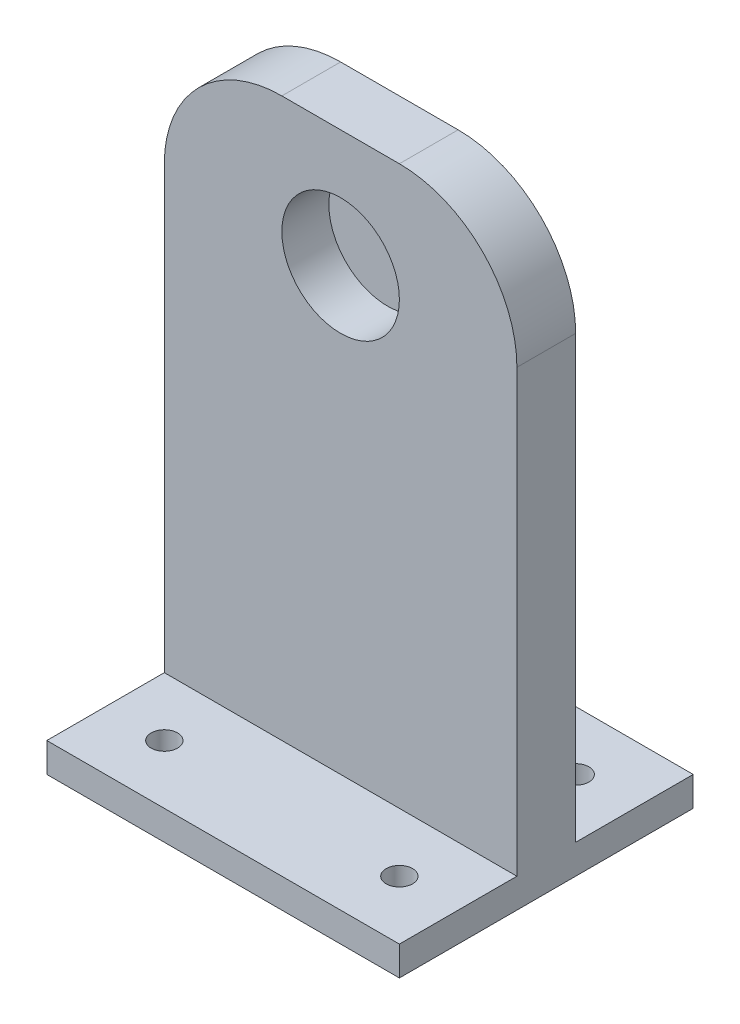
ISO-10303-21;
HEADER;
FILE_DESCRIPTION(('STEP AP214'),'2;1');
FILE_NAME('part.step','',(''),(''),'','','');
FILE_SCHEMA(('AUTOMOTIVE_DESIGN { 1 0 10303 214 1 1 1 1 }'));
ENDSEC;
DATA;
#1=APPLICATION_CONTEXT('core data for automotive mechanical design processes');
#2=APPLICATION_PROTOCOL_DEFINITION('international standard','automotive_design',2000,#1);
#3=PRODUCT_CONTEXT('',#1,'mechanical');
#4=PRODUCT('Part','Part','',(#3));
#5=PRODUCT_RELATED_PRODUCT_CATEGORY('part','',(#4));
#6=PRODUCT_DEFINITION_FORMATION('','',#4);
#7=PRODUCT_DEFINITION_CONTEXT('part definition',#1,'design');
#8=PRODUCT_DEFINITION('design','',#6,#7);
#9=PRODUCT_DEFINITION_SHAPE('','',#8);
#10=(LENGTH_UNIT() NAMED_UNIT(*) SI_UNIT(.MILLI.,.METRE.));
#11=(NAMED_UNIT(*) PLANE_ANGLE_UNIT() SI_UNIT($,.RADIAN.));
#12=(NAMED_UNIT(*) SI_UNIT($,.STERADIAN.) SOLID_ANGLE_UNIT());
#13=UNCERTAINTY_MEASURE_WITH_UNIT(LENGTH_MEASURE(1.E-05),#10,'distance_accuracy_value','');
#14=(GEOMETRIC_REPRESENTATION_CONTEXT(3) GLOBAL_UNCERTAINTY_ASSIGNED_CONTEXT((#13)) GLOBAL_UNIT_ASSIGNED_CONTEXT((#10,
#11,#12)) REPRESENTATION_CONTEXT('',''));
#15=CARTESIAN_POINT('',(0.,0.,0.));
#16=DIRECTION('',(0.,0.,1.));
#17=DIRECTION('',(1.,0.,0.));
#18=AXIS2_PLACEMENT_3D('',#15,#16,#17);
#19=CARTESIAN_POINT('',(0.,0.,10.));
#20=DIRECTION('',(0.,0.,1.));
#21=DIRECTION('',(1.,0.,0.));
#22=AXIS2_PLACEMENT_3D('',#19,#20,#21);
#23=PLANE('',#22);
#24=CARTESIAN_POINT('',(0.,80.,10.));
#25=DIRECTION('',(0.,0.,1.));
#26=DIRECTION('',(1.,0.,0.));
#27=AXIS2_PLACEMENT_3D('',#24,#25,#26);
#28=CIRCLE('',#27,10.);
#29=CARTESIAN_POINT('',(10.,80.,10.));
#30=VERTEX_POINT('',#29);
#31=EDGE_CURVE('E171',#30,#30,#28,.T.);
#32=ORIENTED_EDGE('',*,*,#31,.F.);
#33=EDGE_LOOP('',(#32));
#34=FACE_BOUND('',#33,.T.);
#35=DIRECTION('',(0.,-1.,0.));
#36=VECTOR('',#35,1.);
#37=CARTESIAN_POINT('',(-30.,100.,10.));
#38=LINE('',#37,#36);
#39=CARTESIAN_POINT('',(-30.,80.,10.));
#40=VERTEX_POINT('',#39);
#41=CARTESIAN_POINT('',(-30.,5.,10.));
#42=VERTEX_POINT('',#41);
#43=EDGE_CURVE('E59',#40,#42,#38,.T.);
#44=ORIENTED_EDGE('',*,*,#43,.T.);
#45=DIRECTION('',(1.,0.,0.));
#46=VECTOR('',#45,1.);
#47=CARTESIAN_POINT('',(0.,5.,10.));
#48=LINE('',#47,#46);
#49=CARTESIAN_POINT('',(30.,5.,10.));
#50=VERTEX_POINT('',#49);
#51=EDGE_CURVE('E63',#42,#50,#48,.T.);
#52=ORIENTED_EDGE('',*,*,#51,.T.);
#53=DIRECTION('',(0.,1.,0.));
#54=VECTOR('',#53,1.);
#55=CARTESIAN_POINT('',(30.,100.,10.));
#56=LINE('',#55,#54);
#57=CARTESIAN_POINT('',(30.,80.,10.));
#58=VERTEX_POINT('',#57);
#59=EDGE_CURVE('E175',#50,#58,#56,.T.);
#60=ORIENTED_EDGE('',*,*,#59,.T.);
#61=CARTESIAN_POINT('',(10.,80.,10.));
#62=DIRECTION('',(0.,0.,1.));
#63=DIRECTION('',(1.,0.,0.));
#64=AXIS2_PLACEMENT_3D('',#61,#62,#63);
#65=CIRCLE('',#64,20.);
#66=CARTESIAN_POINT('',(10.,100.,10.));
#67=VERTEX_POINT('',#66);
#68=EDGE_CURVE('E52',#58,#67,#65,.T.);
#69=ORIENTED_EDGE('',*,*,#68,.T.);
#70=DIRECTION('',(-1.,0.,0.));
#71=VECTOR('',#70,1.);
#72=CARTESIAN_POINT('',(-30.,100.,10.));
#73=LINE('',#72,#71);
#74=CARTESIAN_POINT('',(-9.99999999999999,100.,10.));
#75=VERTEX_POINT('',#74);
#76=EDGE_CURVE('E178',#67,#75,#73,.T.);
#77=ORIENTED_EDGE('',*,*,#76,.T.);
#78=CARTESIAN_POINT('',(-9.99999999999999,80.,10.));
#79=DIRECTION('',(0.,0.,1.));
#80=DIRECTION('',(1.,0.,0.));
#81=AXIS2_PLACEMENT_3D('',#78,#79,#80);
#82=CIRCLE('',#81,20.);
#83=EDGE_CURVE('E203',#75,#40,#82,.T.);
#84=ORIENTED_EDGE('',*,*,#83,.T.);
#85=EDGE_LOOP('',(#44,#52,#60,#69,#77,#84));
#86=FACE_BOUND('',#85,.T.);
#87=ADVANCED_FACE('F44',(#34,#86),#23,.T.);
#88=CARTESIAN_POINT('',(0.,0.,0.));
#89=DIRECTION('',(0.,0.,1.));
#90=DIRECTION('',(1.,0.,0.));
#91=AXIS2_PLACEMENT_3D('',#88,#89,#90);
#92=PLANE('',#91);
#93=DIRECTION('',(1.,0.,0.));
#94=VECTOR('',#93,1.);
#95=CARTESIAN_POINT('',(0.,5.,0.));
#96=LINE('',#95,#94);
#97=CARTESIAN_POINT('',(-30.,5.,0.));
#98=VERTEX_POINT('',#97);
#99=CARTESIAN_POINT('',(30.,5.,0.));
#100=VERTEX_POINT('',#99);
#101=EDGE_CURVE('E161',#98,#100,#96,.T.);
#102=ORIENTED_EDGE('',*,*,#101,.F.);
#103=DIRECTION('',(0.,-1.,0.));
#104=VECTOR('',#103,1.);
#105=CARTESIAN_POINT('',(-30.,100.,0.));
#106=LINE('',#105,#104);
#107=CARTESIAN_POINT('',(-30.,80.,0.));
#108=VERTEX_POINT('',#107);
#109=EDGE_CURVE('E125',#108,#98,#106,.T.);
#110=ORIENTED_EDGE('',*,*,#109,.F.);
#111=CARTESIAN_POINT('',(-9.99999999999999,80.,0.));
#112=DIRECTION('',(0.,0.,1.));
#113=DIRECTION('',(1.,0.,0.));
#114=AXIS2_PLACEMENT_3D('',#111,#112,#113);
#115=CIRCLE('',#114,20.);
#116=CARTESIAN_POINT('',(-9.99999999999999,100.,0.));
#117=VERTEX_POINT('',#116);
#118=EDGE_CURVE('E195',#108,#117,#115,.F.);
#119=ORIENTED_EDGE('',*,*,#118,.T.);
#120=DIRECTION('',(-1.,0.,0.));
#121=VECTOR('',#120,1.);
#122=CARTESIAN_POINT('',(-30.,100.,0.));
#123=LINE('',#122,#121);
#124=CARTESIAN_POINT('',(10.,100.,0.));
#125=VERTEX_POINT('',#124);
#126=EDGE_CURVE('E176',#125,#117,#123,.T.);
#127=ORIENTED_EDGE('',*,*,#126,.F.);
#128=CARTESIAN_POINT('',(10.,80.,0.));
#129=DIRECTION('',(0.,0.,1.));
#130=DIRECTION('',(1.,0.,0.));
#131=AXIS2_PLACEMENT_3D('',#128,#129,#130);
#132=CIRCLE('',#131,20.);
#133=CARTESIAN_POINT('',(30.,80.,0.));
#134=VERTEX_POINT('',#133);
#135=EDGE_CURVE('E197',#125,#134,#132,.F.);
#136=ORIENTED_EDGE('',*,*,#135,.T.);
#137=DIRECTION('',(0.,1.,0.));
#138=VECTOR('',#137,1.);
#139=CARTESIAN_POINT('',(30.,100.,0.));
#140=LINE('',#139,#138);
#141=EDGE_CURVE('E183',#100,#134,#140,.T.);
#142=ORIENTED_EDGE('',*,*,#141,.F.);
#143=EDGE_LOOP('',(#102,#110,#119,#127,#136,#142));
#144=FACE_BOUND('',#143,.T.);
#145=ADVANCED_FACE('F217',(#144),#92,.F.);
#146=CARTESIAN_POINT('',(0.,80.,10.));
#147=DIRECTION('',(0.,0.,-1.));
#148=DIRECTION('',(-1.,0.,0.));
#149=AXIS2_PLACEMENT_3D('',#146,#147,#148);
#150=CYLINDRICAL_SURFACE('',#149,10.);
#151=ORIENTED_EDGE('',*,*,#31,.T.);
#152=EDGE_LOOP('',(#151));
#153=FACE_BOUND('',#152,.T.);
#154=CARTESIAN_POINT('',(0.,80.,2.));
#155=DIRECTION('',(0.,0.,-1.));
#156=DIRECTION('',(-1.,0.,0.));
#157=AXIS2_PLACEMENT_3D('',#154,#155,#156);
#158=CIRCLE('',#157,10.);
#159=CARTESIAN_POINT('',(-10.,80.,2.));
#160=VERTEX_POINT('',#159);
#161=EDGE_CURVE('E168',#160,#160,#158,.T.);
#162=ORIENTED_EDGE('',*,*,#161,.T.);
#163=EDGE_LOOP('',(#162));
#164=FACE_BOUND('',#163,.T.);
#165=ADVANCED_FACE('F241',(#153,#164),#150,.F.);
#166=CARTESIAN_POINT('',(-30.,100.,10.));
#167=DIRECTION('',(1.,0.,0.));
#168=DIRECTION('',(0.,1.,0.));
#169=AXIS2_PLACEMENT_3D('',#166,#167,#168);
#170=PLANE('',#169);
#171=DIRECTION('',(0.,0.,-1.));
#172=VECTOR('',#171,1.);
#173=CARTESIAN_POINT('',(-30.,0.,10.));
#174=LINE('',#173,#172);
#175=CARTESIAN_POINT('',(-30.,0.,30.));
#176=VERTEX_POINT('',#175);
#177=CARTESIAN_POINT('',(-30.,0.,-20.));
#178=VERTEX_POINT('',#177);
#179=EDGE_CURVE('E188',#176,#178,#174,.T.);
#180=ORIENTED_EDGE('',*,*,#179,.F.);
#181=DIRECTION('',(0.,-1.,0.));
#182=VECTOR('',#181,1.);
#183=CARTESIAN_POINT('',(-30.,5.,30.));
#184=LINE('',#183,#182);
#185=CARTESIAN_POINT('',(-30.,5.,30.));
#186=VERTEX_POINT('',#185);
#187=EDGE_CURVE('E158',#186,#176,#184,.T.);
#188=ORIENTED_EDGE('',*,*,#187,.F.);
#189=DIRECTION('',(0.,0.,-1.));
#190=VECTOR('',#189,1.);
#191=CARTESIAN_POINT('',(-30.,5.,30.));
#192=LINE('',#191,#190);
#193=EDGE_CURVE('E129',#186,#42,#192,.T.);
#194=ORIENTED_EDGE('',*,*,#193,.T.);
#195=ORIENTED_EDGE('',*,*,#43,.F.);
#196=DIRECTION('',(0.,0.,-1.));
#197=VECTOR('',#196,1.);
#198=CARTESIAN_POINT('',(-30.,80.,10.));
#199=LINE('',#198,#197);
#200=EDGE_CURVE('E13',#40,#108,#199,.T.);
#201=ORIENTED_EDGE('',*,*,#200,.T.);
#202=ORIENTED_EDGE('',*,*,#109,.T.);
#203=CARTESIAN_POINT('',(-30.,5.,-20.));
#204=VERTEX_POINT('',#203);
#205=EDGE_CURVE('E119',#98,#204,#192,.T.);
#206=ORIENTED_EDGE('',*,*,#205,.T.);
#207=DIRECTION('',(0.,-1.,0.));
#208=VECTOR('',#207,1.);
#209=CARTESIAN_POINT('',(-30.,5.,-20.));
#210=LINE('',#209,#208);
#211=EDGE_CURVE('E122',#204,#178,#210,.T.);
#212=ORIENTED_EDGE('',*,*,#211,.T.);
#213=EDGE_LOOP('',(#180,#188,#194,#195,#201,#202,#206,#212));
#214=FACE_BOUND('',#213,.T.);
#215=ADVANCED_FACE('F121',(#214),#170,.F.);
#216=CARTESIAN_POINT('',(-30.,0.,10.));
#217=DIRECTION('',(0.,1.,0.));
#218=DIRECTION('',(0.,0.,1.));
#219=AXIS2_PLACEMENT_3D('',#216,#217,#218);
#220=PLANE('',#219);
#221=CARTESIAN_POINT('',(20.,0.,-10.));
#222=DIRECTION('',(0.,1.,0.));
#223=DIRECTION('',(0.,0.,1.));
#224=AXIS2_PLACEMENT_3D('',#221,#222,#223);
#225=CIRCLE('',#224,2.25);
#226=CARTESIAN_POINT('',(20.,0.,-7.75));
#227=VERTEX_POINT('',#226);
#228=EDGE_CURVE('E303',#227,#227,#225,.T.);
#229=ORIENTED_EDGE('',*,*,#228,.T.);
#230=EDGE_LOOP('',(#229));
#231=FACE_BOUND('',#230,.T.);
#232=CARTESIAN_POINT('',(-20.,0.,20.));
#233=DIRECTION('',(0.,1.,0.));
#234=DIRECTION('',(0.,0.,1.));
#235=AXIS2_PLACEMENT_3D('',#232,#233,#234);
#236=CIRCLE('',#235,2.25);
#237=CARTESIAN_POINT('',(-20.,0.,22.25));
#238=VERTEX_POINT('',#237);
#239=EDGE_CURVE('E309',#238,#238,#236,.T.);
#240=ORIENTED_EDGE('',*,*,#239,.T.);
#241=EDGE_LOOP('',(#240));
#242=FACE_BOUND('',#241,.T.);
#243=CARTESIAN_POINT('',(20.,0.,20.));
#244=DIRECTION('',(0.,1.,0.));
#245=DIRECTION('',(0.,0.,1.));
#246=AXIS2_PLACEMENT_3D('',#243,#244,#245);
#247=CIRCLE('',#246,2.25);
#248=CARTESIAN_POINT('',(20.,0.,22.25));
#249=VERTEX_POINT('',#248);
#250=EDGE_CURVE('E294',#249,#249,#247,.T.);
#251=ORIENTED_EDGE('',*,*,#250,.T.);
#252=EDGE_LOOP('',(#251));
#253=FACE_BOUND('',#252,.T.);
#254=CARTESIAN_POINT('',(-20.,0.,-10.));
#255=DIRECTION('',(0.,1.,0.));
#256=DIRECTION('',(0.,0.,1.));
#257=AXIS2_PLACEMENT_3D('',#254,#255,#256);
#258=CIRCLE('',#257,2.25);
#259=CARTESIAN_POINT('',(-20.,0.,-7.75));
#260=VERTEX_POINT('',#259);
#261=EDGE_CURVE('E155',#260,#260,#258,.T.);
#262=ORIENTED_EDGE('',*,*,#261,.T.);
#263=EDGE_LOOP('',(#262));
#264=FACE_BOUND('',#263,.T.);
#265=ORIENTED_EDGE('',*,*,#179,.T.);
#266=DIRECTION('',(1.,0.,0.));
#267=VECTOR('',#266,1.);
#268=CARTESIAN_POINT('',(-30.,0.,-20.));
#269=LINE('',#268,#267);
#270=CARTESIAN_POINT('',(30.,0.,-20.));
#271=VERTEX_POINT('',#270);
#272=EDGE_CURVE('E138',#178,#271,#269,.T.);
#273=ORIENTED_EDGE('',*,*,#272,.T.);
#274=DIRECTION('',(0.,0.,-1.));
#275=VECTOR('',#274,1.);
#276=CARTESIAN_POINT('',(30.,0.,10.));
#277=LINE('',#276,#275);
#278=CARTESIAN_POINT('',(30.,0.,30.));
#279=VERTEX_POINT('',#278);
#280=EDGE_CURVE('E181',#279,#271,#277,.T.);
#281=ORIENTED_EDGE('',*,*,#280,.F.);
#282=DIRECTION('',(-1.,0.,0.));
#283=VECTOR('',#282,1.);
#284=CARTESIAN_POINT('',(-30.,0.,30.));
#285=LINE('',#284,#283);
#286=EDGE_CURVE('E130',#279,#176,#285,.T.);
#287=ORIENTED_EDGE('',*,*,#286,.T.);
#288=EDGE_LOOP('',(#265,#273,#281,#287));
#289=FACE_BOUND('',#288,.T.);
#290=ADVANCED_FACE('F232',(#231,#242,#253,#264,#289),#220,.F.);
#291=CARTESIAN_POINT('',(30.,100.,10.));
#292=DIRECTION('',(-1.,0.,0.));
#293=DIRECTION('',(0.,-1.,0.));
#294=AXIS2_PLACEMENT_3D('',#291,#292,#293);
#295=PLANE('',#294);
#296=ORIENTED_EDGE('',*,*,#280,.T.);
#297=DIRECTION('',(0.,-1.,0.));
#298=VECTOR('',#297,1.);
#299=CARTESIAN_POINT('',(30.,5.,-20.));
#300=LINE('',#299,#298);
#301=CARTESIAN_POINT('',(30.,5.,-20.));
#302=VERTEX_POINT('',#301);
#303=EDGE_CURVE('E139',#302,#271,#300,.T.);
#304=ORIENTED_EDGE('',*,*,#303,.F.);
#305=DIRECTION('',(0.,0.,1.));
#306=VECTOR('',#305,1.);
#307=CARTESIAN_POINT('',(30.,5.,30.));
#308=LINE('',#307,#306);
#309=EDGE_CURVE('E145',#302,#100,#308,.T.);
#310=ORIENTED_EDGE('',*,*,#309,.T.);
#311=ORIENTED_EDGE('',*,*,#141,.T.);
#312=DIRECTION('',(0.,0.,-1.));
#313=VECTOR('',#312,1.);
#314=CARTESIAN_POINT('',(30.,80.,10.));
#315=LINE('',#314,#313);
#316=EDGE_CURVE('E200',#134,#58,#315,.F.);
#317=ORIENTED_EDGE('',*,*,#316,.T.);
#318=ORIENTED_EDGE('',*,*,#59,.F.);
#319=CARTESIAN_POINT('',(30.,5.,30.));
#320=VERTEX_POINT('',#319);
#321=EDGE_CURVE('E146',#50,#320,#308,.T.);
#322=ORIENTED_EDGE('',*,*,#321,.T.);
#323=DIRECTION('',(0.,-1.,0.));
#324=VECTOR('',#323,1.);
#325=CARTESIAN_POINT('',(30.,5.,30.));
#326=LINE('',#325,#324);
#327=EDGE_CURVE('E162',#320,#279,#326,.T.);
#328=ORIENTED_EDGE('',*,*,#327,.T.);
#329=EDGE_LOOP('',(#296,#304,#310,#311,#317,#318,#322,#328));
#330=FACE_BOUND('',#329,.T.);
#331=ADVANCED_FACE('F230',(#330),#295,.F.);
#332=CARTESIAN_POINT('',(-30.,100.,10.));
#333=DIRECTION('',(0.,-1.,0.));
#334=DIRECTION('',(0.,0.,-1.));
#335=AXIS2_PLACEMENT_3D('',#332,#333,#334);
#336=PLANE('',#335);
#337=ORIENTED_EDGE('',*,*,#76,.F.);
#338=DIRECTION('',(0.,0.,-1.));
#339=VECTOR('',#338,1.);
#340=CARTESIAN_POINT('',(10.,100.,10.));
#341=LINE('',#340,#339);
#342=EDGE_CURVE('E192',#67,#125,#341,.T.);
#343=ORIENTED_EDGE('',*,*,#342,.T.);
#344=ORIENTED_EDGE('',*,*,#126,.T.);
#345=DIRECTION('',(0.,0.,-1.));
#346=VECTOR('',#345,1.);
#347=CARTESIAN_POINT('',(-9.99999999999999,100.,10.));
#348=LINE('',#347,#346);
#349=EDGE_CURVE('E190',#117,#75,#348,.F.);
#350=ORIENTED_EDGE('',*,*,#349,.T.);
#351=EDGE_LOOP('',(#337,#343,#344,#350));
#352=FACE_BOUND('',#351,.T.);
#353=ADVANCED_FACE('F211',(#352),#336,.F.);
#354=CARTESIAN_POINT('',(0.,80.,2.));
#355=DIRECTION('',(0.,0.,-1.));
#356=DIRECTION('',(-1.,0.,0.));
#357=AXIS2_PLACEMENT_3D('',#354,#355,#356);
#358=PLANE('',#357);
#359=ORIENTED_EDGE('',*,*,#161,.F.);
#360=EDGE_LOOP('',(#359));
#361=FACE_BOUND('',#360,.T.);
#362=ADVANCED_FACE('F257',(#361),#358,.F.);
#363=CARTESIAN_POINT('',(10.,80.,10.));
#364=DIRECTION('',(0.,0.,-1.));
#365=DIRECTION('',(-1.,0.,0.));
#366=AXIS2_PLACEMENT_3D('',#363,#364,#365);
#367=CYLINDRICAL_SURFACE('',#366,20.);
#368=ORIENTED_EDGE('',*,*,#68,.F.);
#369=ORIENTED_EDGE('',*,*,#316,.F.);
#370=ORIENTED_EDGE('',*,*,#135,.F.);
#371=ORIENTED_EDGE('',*,*,#342,.F.);
#372=EDGE_LOOP('',(#368,#369,#370,#371));
#373=FACE_BOUND('',#372,.T.);
#374=ADVANCED_FACE('F214',(#373),#367,.T.);
#375=CARTESIAN_POINT('',(-9.99999999999999,80.,10.));
#376=DIRECTION('',(0.,0.,-1.));
#377=DIRECTION('',(-1.,0.,0.));
#378=AXIS2_PLACEMENT_3D('',#375,#376,#377);
#379=CYLINDRICAL_SURFACE('',#378,20.);
#380=ORIENTED_EDGE('',*,*,#83,.F.);
#381=ORIENTED_EDGE('',*,*,#349,.F.);
#382=ORIENTED_EDGE('',*,*,#118,.F.);
#383=ORIENTED_EDGE('',*,*,#200,.F.);
#384=EDGE_LOOP('',(#380,#381,#382,#383));
#385=FACE_BOUND('',#384,.T.);
#386=ADVANCED_FACE('F46',(#385),#379,.T.);
#387=CARTESIAN_POINT('',(-30.,5.,-20.));
#388=DIRECTION('',(0.,0.,-1.));
#389=DIRECTION('',(-1.,0.,0.));
#390=AXIS2_PLACEMENT_3D('',#387,#388,#389);
#391=PLANE('',#390);
#392=ORIENTED_EDGE('',*,*,#272,.F.);
#393=ORIENTED_EDGE('',*,*,#211,.F.);
#394=DIRECTION('',(1.,0.,0.));
#395=VECTOR('',#394,1.);
#396=CARTESIAN_POINT('',(-30.,5.,-20.));
#397=LINE('',#396,#395);
#398=EDGE_CURVE('E136',#204,#302,#397,.T.);
#399=ORIENTED_EDGE('',*,*,#398,.T.);
#400=ORIENTED_EDGE('',*,*,#303,.T.);
#401=EDGE_LOOP('',(#392,#393,#399,#400));
#402=FACE_BOUND('',#401,.T.);
#403=ADVANCED_FACE('F134',(#402),#391,.T.);
#404=CARTESIAN_POINT('',(0.,5.,0.));
#405=DIRECTION('',(0.,-1.,0.));
#406=DIRECTION('',(0.,0.,-1.));
#407=AXIS2_PLACEMENT_3D('',#404,#405,#406);
#408=PLANE('',#407);
#409=CARTESIAN_POINT('',(20.,5.,-10.));
#410=DIRECTION('',(0.,1.,0.));
#411=DIRECTION('',(0.,0.,1.));
#412=AXIS2_PLACEMENT_3D('',#409,#410,#411);
#413=CIRCLE('',#412,2.25);
#414=CARTESIAN_POINT('',(20.,5.,-7.75));
#415=VERTEX_POINT('',#414);
#416=EDGE_CURVE('E306',#415,#415,#413,.T.);
#417=ORIENTED_EDGE('',*,*,#416,.F.);
#418=EDGE_LOOP('',(#417));
#419=FACE_BOUND('',#418,.T.);
#420=CARTESIAN_POINT('',(-20.,5.,-10.));
#421=DIRECTION('',(0.,1.,0.));
#422=DIRECTION('',(0.,0.,1.));
#423=AXIS2_PLACEMENT_3D('',#420,#421,#422);
#424=CIRCLE('',#423,2.25);
#425=CARTESIAN_POINT('',(-20.,5.,-7.75));
#426=VERTEX_POINT('',#425);
#427=EDGE_CURVE('E305',#426,#426,#424,.T.);
#428=ORIENTED_EDGE('',*,*,#427,.F.);
#429=EDGE_LOOP('',(#428));
#430=FACE_BOUND('',#429,.T.);
#431=ORIENTED_EDGE('',*,*,#205,.F.);
#432=ORIENTED_EDGE('',*,*,#101,.T.);
#433=ORIENTED_EDGE('',*,*,#309,.F.);
#434=ORIENTED_EDGE('',*,*,#398,.F.);
#435=EDGE_LOOP('',(#431,#432,#433,#434));
#436=FACE_BOUND('',#435,.T.);
#437=ADVANCED_FACE('F143',(#419,#430,#436),#408,.F.);
#438=CARTESIAN_POINT('',(-30.,5.,30.));
#439=DIRECTION('',(0.,0.,1.));
#440=DIRECTION('',(1.,0.,0.));
#441=AXIS2_PLACEMENT_3D('',#438,#439,#440);
#442=PLANE('',#441);
#443=ORIENTED_EDGE('',*,*,#286,.F.);
#444=ORIENTED_EDGE('',*,*,#327,.F.);
#445=DIRECTION('',(-1.,0.,0.));
#446=VECTOR('',#445,1.);
#447=CARTESIAN_POINT('',(-30.,5.,30.));
#448=LINE('',#447,#446);
#449=EDGE_CURVE('E140',#320,#186,#448,.T.);
#450=ORIENTED_EDGE('',*,*,#449,.T.);
#451=ORIENTED_EDGE('',*,*,#187,.T.);
#452=EDGE_LOOP('',(#443,#444,#450,#451));
#453=FACE_BOUND('',#452,.T.);
#454=ADVANCED_FACE('F228',(#453),#442,.T.);
#455=CARTESIAN_POINT('',(-20.,5.,20.));
#456=DIRECTION('',(0.,1.,0.));
#457=DIRECTION('',(0.,0.,1.));
#458=AXIS2_PLACEMENT_3D('',#455,#456,#457);
#459=CIRCLE('',#458,2.25);
#460=CARTESIAN_POINT('',(-20.,5.,22.25));
#461=VERTEX_POINT('',#460);
#462=EDGE_CURVE('E300',#461,#461,#459,.T.);
#463=ORIENTED_EDGE('',*,*,#462,.F.);
#464=EDGE_LOOP('',(#463));
#465=FACE_BOUND('',#464,.T.);
#466=CARTESIAN_POINT('',(20.,5.,20.));
#467=DIRECTION('',(0.,1.,0.));
#468=DIRECTION('',(0.,0.,1.));
#469=AXIS2_PLACEMENT_3D('',#466,#467,#468);
#470=CIRCLE('',#469,2.25);
#471=CARTESIAN_POINT('',(20.,5.,22.25));
#472=VERTEX_POINT('',#471);
#473=EDGE_CURVE('E297',#472,#472,#470,.T.);
#474=ORIENTED_EDGE('',*,*,#473,.F.);
#475=EDGE_LOOP('',(#474));
#476=FACE_BOUND('',#475,.T.);
#477=ORIENTED_EDGE('',*,*,#51,.F.);
#478=ORIENTED_EDGE('',*,*,#193,.F.);
#479=ORIENTED_EDGE('',*,*,#449,.F.);
#480=ORIENTED_EDGE('',*,*,#321,.F.);
#481=EDGE_LOOP('',(#477,#478,#479,#480));
#482=FACE_BOUND('',#481,.T.);
#483=ADVANCED_FACE('F223',(#465,#476,#482),#408,.F.);
#484=CARTESIAN_POINT('',(20.,0.,20.));
#485=DIRECTION('',(0.,1.,0.));
#486=DIRECTION('',(0.,0.,1.));
#487=AXIS2_PLACEMENT_3D('',#484,#485,#486);
#488=CYLINDRICAL_SURFACE('',#487,2.25);
#489=ORIENTED_EDGE('',*,*,#250,.F.);
#490=EDGE_LOOP('',(#489));
#491=FACE_BOUND('',#490,.T.);
#492=ORIENTED_EDGE('',*,*,#473,.T.);
#493=EDGE_LOOP('',(#492));
#494=FACE_BOUND('',#493,.T.);
#495=ADVANCED_FACE('F273',(#491,#494),#488,.F.);
#496=CARTESIAN_POINT('',(-20.,0.,20.));
#497=DIRECTION('',(0.,1.,0.));
#498=DIRECTION('',(0.,0.,1.));
#499=AXIS2_PLACEMENT_3D('',#496,#497,#498);
#500=CYLINDRICAL_SURFACE('',#499,2.25);
#501=ORIENTED_EDGE('',*,*,#239,.F.);
#502=EDGE_LOOP('',(#501));
#503=FACE_BOUND('',#502,.T.);
#504=ORIENTED_EDGE('',*,*,#462,.T.);
#505=EDGE_LOOP('',(#504));
#506=FACE_BOUND('',#505,.T.);
#507=ADVANCED_FACE('F279',(#503,#506),#500,.F.);
#508=CARTESIAN_POINT('',(-20.,0.,-10.));
#509=DIRECTION('',(0.,1.,0.));
#510=DIRECTION('',(0.,0.,1.));
#511=AXIS2_PLACEMENT_3D('',#508,#509,#510);
#512=CYLINDRICAL_SURFACE('',#511,2.25);
#513=ORIENTED_EDGE('',*,*,#261,.F.);
#514=EDGE_LOOP('',(#513));
#515=FACE_BOUND('',#514,.T.);
#516=ORIENTED_EDGE('',*,*,#427,.T.);
#517=EDGE_LOOP('',(#516));
#518=FACE_BOUND('',#517,.T.);
#519=ADVANCED_FACE('F275',(#515,#518),#512,.F.);
#520=CARTESIAN_POINT('',(20.,0.,-10.));
#521=DIRECTION('',(0.,1.,0.));
#522=DIRECTION('',(0.,0.,1.));
#523=AXIS2_PLACEMENT_3D('',#520,#521,#522);
#524=CYLINDRICAL_SURFACE('',#523,2.25);
#525=ORIENTED_EDGE('',*,*,#228,.F.);
#526=EDGE_LOOP('',(#525));
#527=FACE_BOUND('',#526,.T.);
#528=ORIENTED_EDGE('',*,*,#416,.T.);
#529=EDGE_LOOP('',(#528));
#530=FACE_BOUND('',#529,.T.);
#531=ADVANCED_FACE('F278',(#527,#530),#524,.F.);
#532=CLOSED_SHELL('',(#87,#145,#165,#215,#290,#331,#353,#362,#374,#386,#403,#437,#454,#483,#495,
#507,#519,#531));
#533=MANIFOLD_SOLID_BREP('B2',#532);
#534=ADVANCED_BREP_SHAPE_REPRESENTATION('',(#18,#533),#14);
#535=SHAPE_DEFINITION_REPRESENTATION(#9,#534);
ENDSEC;
END-ISO-10303-21;
